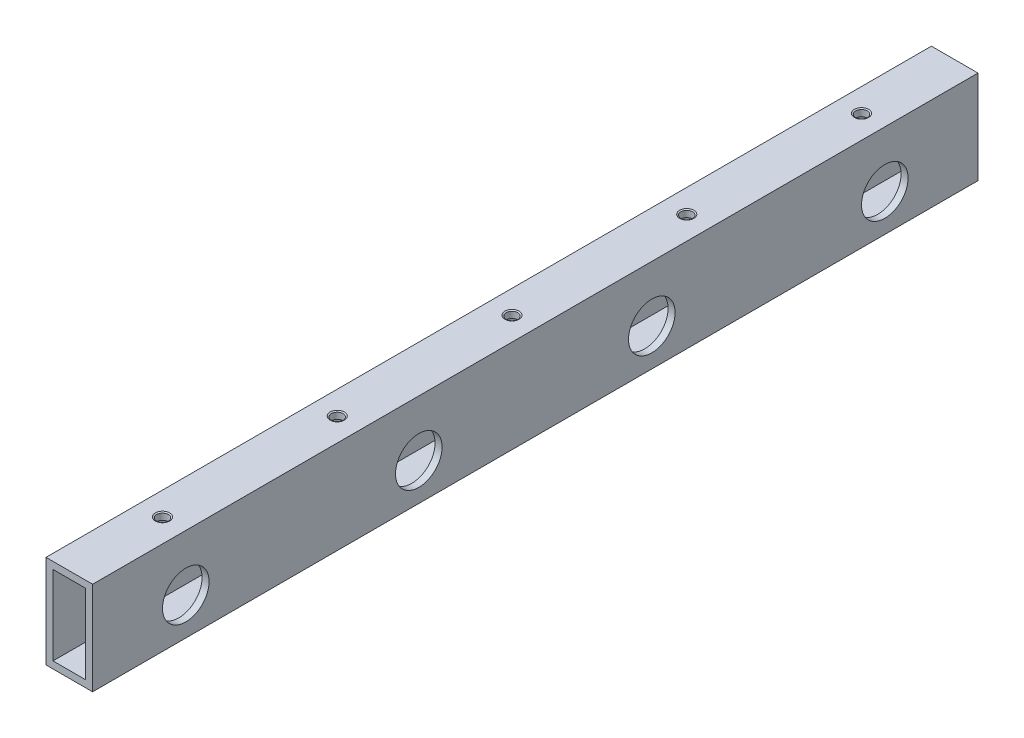
ISO-10303-21;
HEADER;
FILE_DESCRIPTION(('STEP AP214'),'2;1');
FILE_NAME('part.step','',(''),(''),'','','');
FILE_SCHEMA(('AUTOMOTIVE_DESIGN { 1 0 10303 214 1 1 1 1 }'));
ENDSEC;
DATA;
#1=APPLICATION_CONTEXT('core data for automotive mechanical design processes');
#2=APPLICATION_PROTOCOL_DEFINITION('international standard','automotive_design',2000,#1);
#3=PRODUCT_CONTEXT('',#1,'mechanical');
#4=PRODUCT('Part','Part','',(#3));
#5=PRODUCT_RELATED_PRODUCT_CATEGORY('part','',(#4));
#6=PRODUCT_DEFINITION_FORMATION('','',#4);
#7=PRODUCT_DEFINITION_CONTEXT('part definition',#1,'design');
#8=PRODUCT_DEFINITION('design','',#6,#7);
#9=PRODUCT_DEFINITION_SHAPE('','',#8);
#10=(LENGTH_UNIT() NAMED_UNIT(*) SI_UNIT(.MILLI.,.METRE.));
#11=(NAMED_UNIT(*) PLANE_ANGLE_UNIT() SI_UNIT($,.RADIAN.));
#12=(NAMED_UNIT(*) SI_UNIT($,.STERADIAN.) SOLID_ANGLE_UNIT());
#13=UNCERTAINTY_MEASURE_WITH_UNIT(LENGTH_MEASURE(1.E-05),#10,'distance_accuracy_value','');
#14=(GEOMETRIC_REPRESENTATION_CONTEXT(3) GLOBAL_UNCERTAINTY_ASSIGNED_CONTEXT((#13)) GLOBAL_UNIT_ASSIGNED_CONTEXT((#10,
#11,#12)) REPRESENTATION_CONTEXT('',''));
#15=CARTESIAN_POINT('',(0.,0.,0.));
#16=DIRECTION('',(0.,0.,1.));
#17=DIRECTION('',(1.,0.,0.));
#18=AXIS2_PLACEMENT_3D('',#15,#16,#17);
#19=CARTESIAN_POINT('',(0.,0.,190.));
#20=DIRECTION('',(0.,0.,1.));
#21=DIRECTION('',(1.,0.,0.));
#22=AXIS2_PLACEMENT_3D('',#19,#20,#21);
#23=PLANE('',#22);
#24=DIRECTION('',(0.,-1.,0.));
#25=VECTOR('',#24,1.);
#26=CARTESIAN_POINT('',(0.,0.,190.));
#27=LINE('',#26,#25);
#28=CARTESIAN_POINT('',(0.,20.,190.));
#29=VERTEX_POINT('',#28);
#30=CARTESIAN_POINT('',(0.,0.,190.));
#31=VERTEX_POINT('',#30);
#32=EDGE_CURVE('E169',#29,#31,#27,.T.);
#33=ORIENTED_EDGE('',*,*,#32,.T.);
#34=DIRECTION('',(1.,0.,0.));
#35=VECTOR('',#34,1.);
#36=CARTESIAN_POINT('',(0.,0.,190.));
#37=LINE('',#36,#35);
#38=CARTESIAN_POINT('',(10.,0.,190.));
#39=VERTEX_POINT('',#38);
#40=EDGE_CURVE('E172',#31,#39,#37,.T.);
#41=ORIENTED_EDGE('',*,*,#40,.T.);
#42=DIRECTION('',(0.,1.,0.));
#43=VECTOR('',#42,1.);
#44=CARTESIAN_POINT('',(10.,0.,190.));
#45=LINE('',#44,#43);
#46=CARTESIAN_POINT('',(10.,20.,190.));
#47=VERTEX_POINT('',#46);
#48=EDGE_CURVE('E175',#39,#47,#45,.T.);
#49=ORIENTED_EDGE('',*,*,#48,.T.);
#50=DIRECTION('',(-1.,0.,0.));
#51=VECTOR('',#50,1.);
#52=CARTESIAN_POINT('',(0.,20.,190.));
#53=LINE('',#52,#51);
#54=EDGE_CURVE('E177',#47,#29,#53,.T.);
#55=ORIENTED_EDGE('',*,*,#54,.T.);
#56=EDGE_LOOP('',(#33,#41,#49,#55));
#57=FACE_BOUND('',#56,.T.);
#58=DIRECTION('',(1.,0.,0.));
#59=VECTOR('',#58,1.);
#60=CARTESIAN_POINT('',(0.,1.5,190.));
#61=LINE('',#60,#59);
#62=CARTESIAN_POINT('',(1.5,1.5,190.));
#63=VERTEX_POINT('',#62);
#64=CARTESIAN_POINT('',(8.5,1.5,190.));
#65=VERTEX_POINT('',#64);
#66=EDGE_CURVE('E139',#63,#65,#61,.T.);
#67=ORIENTED_EDGE('',*,*,#66,.F.);
#68=DIRECTION('',(0.,-1.,0.));
#69=VECTOR('',#68,1.);
#70=CARTESIAN_POINT('',(1.5,20.,190.));
#71=LINE('',#70,#69);
#72=CARTESIAN_POINT('',(1.5,18.5,190.));
#73=VERTEX_POINT('',#72);
#74=EDGE_CURVE('E131',#73,#63,#71,.T.);
#75=ORIENTED_EDGE('',*,*,#74,.F.);
#76=DIRECTION('',(-1.,0.,0.));
#77=VECTOR('',#76,1.);
#78=CARTESIAN_POINT('',(0.,18.5,190.));
#79=LINE('',#78,#77);
#80=CARTESIAN_POINT('',(8.5,18.5,190.));
#81=VERTEX_POINT('',#80);
#82=EDGE_CURVE('E153',#81,#73,#79,.T.);
#83=ORIENTED_EDGE('',*,*,#82,.F.);
#84=DIRECTION('',(0.,1.,0.));
#85=VECTOR('',#84,1.);
#86=CARTESIAN_POINT('',(8.5,20.,190.));
#87=LINE('',#86,#85);
#88=EDGE_CURVE('E151',#65,#81,#87,.T.);
#89=ORIENTED_EDGE('',*,*,#88,.F.);
#90=EDGE_LOOP('',(#67,#75,#83,#89));
#91=FACE_BOUND('',#90,.T.);
#92=ADVANCED_FACE('F64',(#57,#91),#23,.T.);
#93=CARTESIAN_POINT('',(0.,0.,0.));
#94=DIRECTION('',(0.,0.,1.));
#95=DIRECTION('',(1.,0.,0.));
#96=AXIS2_PLACEMENT_3D('',#93,#94,#95);
#97=PLANE('',#96);
#98=DIRECTION('',(0.,-1.,0.));
#99=VECTOR('',#98,1.);
#100=CARTESIAN_POINT('',(0.,0.,0.));
#101=LINE('',#100,#99);
#102=CARTESIAN_POINT('',(0.,20.,0.));
#103=VERTEX_POINT('',#102);
#104=CARTESIAN_POINT('',(0.,0.,0.));
#105=VERTEX_POINT('',#104);
#106=EDGE_CURVE('E147',#103,#105,#101,.T.);
#107=ORIENTED_EDGE('',*,*,#106,.F.);
#108=DIRECTION('',(-1.,0.,0.));
#109=VECTOR('',#108,1.);
#110=CARTESIAN_POINT('',(0.,20.,0.));
#111=LINE('',#110,#109);
#112=CARTESIAN_POINT('',(10.,20.,0.));
#113=VERTEX_POINT('',#112);
#114=EDGE_CURVE('E173',#113,#103,#111,.T.);
#115=ORIENTED_EDGE('',*,*,#114,.F.);
#116=DIRECTION('',(0.,1.,0.));
#117=VECTOR('',#116,1.);
#118=CARTESIAN_POINT('',(10.,0.,0.));
#119=LINE('',#118,#117);
#120=CARTESIAN_POINT('',(10.,0.,0.));
#121=VERTEX_POINT('',#120);
#122=EDGE_CURVE('E184',#121,#113,#119,.T.);
#123=ORIENTED_EDGE('',*,*,#122,.F.);
#124=DIRECTION('',(1.,0.,0.));
#125=VECTOR('',#124,1.);
#126=CARTESIAN_POINT('',(0.,0.,0.));
#127=LINE('',#126,#125);
#128=EDGE_CURVE('E182',#105,#121,#127,.T.);
#129=ORIENTED_EDGE('',*,*,#128,.F.);
#130=EDGE_LOOP('',(#107,#115,#123,#129));
#131=FACE_BOUND('',#130,.T.);
#132=DIRECTION('',(0.,-1.,0.));
#133=VECTOR('',#132,1.);
#134=CARTESIAN_POINT('',(1.5,20.,0.));
#135=LINE('',#134,#133);
#136=CARTESIAN_POINT('',(1.5,18.5,0.));
#137=VERTEX_POINT('',#136);
#138=CARTESIAN_POINT('',(1.5,1.5,0.));
#139=VERTEX_POINT('',#138);
#140=EDGE_CURVE('E89',#137,#139,#135,.T.);
#141=ORIENTED_EDGE('',*,*,#140,.T.);
#142=DIRECTION('',(1.,0.,0.));
#143=VECTOR('',#142,1.);
#144=CARTESIAN_POINT('',(0.,1.5,0.));
#145=LINE('',#144,#143);
#146=CARTESIAN_POINT('',(8.5,1.5,0.));
#147=VERTEX_POINT('',#146);
#148=EDGE_CURVE('E146',#139,#147,#145,.T.);
#149=ORIENTED_EDGE('',*,*,#148,.T.);
#150=DIRECTION('',(0.,1.,0.));
#151=VECTOR('',#150,1.);
#152=CARTESIAN_POINT('',(8.5,20.,0.));
#153=LINE('',#152,#151);
#154=CARTESIAN_POINT('',(8.5,18.5,0.));
#155=VERTEX_POINT('',#154);
#156=EDGE_CURVE('E161',#147,#155,#153,.T.);
#157=ORIENTED_EDGE('',*,*,#156,.T.);
#158=DIRECTION('',(-1.,0.,0.));
#159=VECTOR('',#158,1.);
#160=CARTESIAN_POINT('',(0.,18.5,0.));
#161=LINE('',#160,#159);
#162=EDGE_CURVE('E140',#155,#137,#161,.T.);
#163=ORIENTED_EDGE('',*,*,#162,.T.);
#164=EDGE_LOOP('',(#141,#149,#157,#163));
#165=FACE_BOUND('',#164,.T.);
#166=ADVANCED_FACE('F283',(#131,#165),#97,.F.);
#167=CARTESIAN_POINT('',(0.,0.,190.));
#168=DIRECTION('',(1.,0.,0.));
#169=DIRECTION('',(0.,0.,-1.));
#170=AXIS2_PLACEMENT_3D('',#167,#168,#169);
#171=PLANE('',#170);
#172=ORIENTED_EDGE('',*,*,#106,.T.);
#173=DIRECTION('',(0.,0.,-1.));
#174=VECTOR('',#173,1.);
#175=CARTESIAN_POINT('',(0.,0.,190.));
#176=LINE('',#175,#174);
#177=EDGE_CURVE('E12',#31,#105,#176,.T.);
#178=ORIENTED_EDGE('',*,*,#177,.F.);
#179=ORIENTED_EDGE('',*,*,#32,.F.);
#180=DIRECTION('',(0.,0.,-1.));
#181=VECTOR('',#180,1.);
#182=CARTESIAN_POINT('',(0.,20.,190.));
#183=LINE('',#182,#181);
#184=EDGE_CURVE('E179',#29,#103,#183,.T.);
#185=ORIENTED_EDGE('',*,*,#184,.T.);
#186=EDGE_LOOP('',(#172,#178,#179,#185));
#187=FACE_BOUND('',#186,.T.);
#188=ADVANCED_FACE('F66',(#187),#171,.F.);
#189=CARTESIAN_POINT('',(0.,0.,190.));
#190=DIRECTION('',(0.,1.,0.));
#191=DIRECTION('',(0.,0.,1.));
#192=AXIS2_PLACEMENT_3D('',#189,#190,#191);
#193=PLANE('',#192);
#194=ORIENTED_EDGE('',*,*,#128,.T.);
#195=DIRECTION('',(0.,0.,-1.));
#196=VECTOR('',#195,1.);
#197=CARTESIAN_POINT('',(10.,0.,190.));
#198=LINE('',#197,#196);
#199=EDGE_CURVE('E73',#39,#121,#198,.T.);
#200=ORIENTED_EDGE('',*,*,#199,.F.);
#201=ORIENTED_EDGE('',*,*,#40,.F.);
#202=ORIENTED_EDGE('',*,*,#177,.T.);
#203=EDGE_LOOP('',(#194,#200,#201,#202));
#204=FACE_BOUND('',#203,.T.);
#205=ADVANCED_FACE('F287',(#204),#193,.F.);
#206=CARTESIAN_POINT('',(10.,0.,190.));
#207=DIRECTION('',(-1.,0.,0.));
#208=DIRECTION('',(0.,0.,1.));
#209=AXIS2_PLACEMENT_3D('',#206,#207,#208);
#210=PLANE('',#209);
#211=CARTESIAN_POINT('',(10.,8.,170.));
#212=DIRECTION('',(1.,0.,0.));
#213=DIRECTION('',(0.,0.,-1.));
#214=AXIS2_PLACEMENT_3D('',#211,#212,#213);
#215=CIRCLE('',#214,5.00000000000001);
#216=CARTESIAN_POINT('',(10.,8.,165.));
#217=VERTEX_POINT('',#216);
#218=EDGE_CURVE('E372',#217,#217,#215,.T.);
#219=ORIENTED_EDGE('',*,*,#218,.F.);
#220=EDGE_LOOP('',(#219));
#221=FACE_BOUND('',#220,.T.);
#222=CARTESIAN_POINT('',(10.,8.,120.));
#223=DIRECTION('',(1.,0.,0.));
#224=DIRECTION('',(0.,0.,-1.));
#225=AXIS2_PLACEMENT_3D('',#222,#223,#224);
#226=CIRCLE('',#225,5.00000000000001);
#227=CARTESIAN_POINT('',(10.,8.,115.));
#228=VERTEX_POINT('',#227);
#229=EDGE_CURVE('E234',#228,#228,#226,.T.);
#230=ORIENTED_EDGE('',*,*,#229,.F.);
#231=EDGE_LOOP('',(#230));
#232=FACE_BOUND('',#231,.T.);
#233=CARTESIAN_POINT('',(10.,8.,70.));
#234=DIRECTION('',(1.,0.,0.));
#235=DIRECTION('',(0.,0.,-1.));
#236=AXIS2_PLACEMENT_3D('',#233,#234,#235);
#237=CIRCLE('',#236,5.00000000000001);
#238=CARTESIAN_POINT('',(10.,8.,65.));
#239=VERTEX_POINT('',#238);
#240=EDGE_CURVE('E223',#239,#239,#237,.T.);
#241=ORIENTED_EDGE('',*,*,#240,.F.);
#242=EDGE_LOOP('',(#241));
#243=FACE_BOUND('',#242,.T.);
#244=CARTESIAN_POINT('',(10.,8.,20.));
#245=DIRECTION('',(1.,0.,0.));
#246=DIRECTION('',(0.,0.,-1.));
#247=AXIS2_PLACEMENT_3D('',#244,#245,#246);
#248=CIRCLE('',#247,5.00000000000001);
#249=CARTESIAN_POINT('',(10.,8.,15.));
#250=VERTEX_POINT('',#249);
#251=EDGE_CURVE('E220',#250,#250,#248,.T.);
#252=ORIENTED_EDGE('',*,*,#251,.F.);
#253=EDGE_LOOP('',(#252));
#254=FACE_BOUND('',#253,.T.);
#255=ORIENTED_EDGE('',*,*,#122,.T.);
#256=DIRECTION('',(0.,0.,-1.));
#257=VECTOR('',#256,1.);
#258=CARTESIAN_POINT('',(10.,20.,190.));
#259=LINE('',#258,#257);
#260=EDGE_CURVE('E189',#47,#113,#259,.T.);
#261=ORIENTED_EDGE('',*,*,#260,.F.);
#262=ORIENTED_EDGE('',*,*,#48,.F.);
#263=ORIENTED_EDGE('',*,*,#199,.T.);
#264=EDGE_LOOP('',(#255,#261,#262,#263));
#265=FACE_BOUND('',#264,.T.);
#266=ADVANCED_FACE('F270',(#221,#232,#243,#254,#265),#210,.F.);
#267=CARTESIAN_POINT('',(0.,20.,190.));
#268=DIRECTION('',(0.,-1.,0.));
#269=DIRECTION('',(0.,0.,-1.));
#270=AXIS2_PLACEMENT_3D('',#267,#268,#269);
#271=PLANE('',#270);
#272=CARTESIAN_POINT('',(5.,20.,20.));
#273=DIRECTION('',(0.,1.,0.));
#274=DIRECTION('',(0.,0.,1.));
#275=AXIS2_PLACEMENT_3D('',#272,#273,#274);
#276=CIRCLE('',#275,1.525);
#277=CARTESIAN_POINT('',(5.,20.,21.525));
#278=VERTEX_POINT('',#277);
#279=EDGE_CURVE('E219',#278,#278,#276,.T.);
#280=ORIENTED_EDGE('',*,*,#279,.F.);
#281=EDGE_LOOP('',(#280));
#282=FACE_BOUND('',#281,.T.);
#283=CARTESIAN_POINT('',(4.99999999999993,20.,57.5));
#284=DIRECTION('',(0.,1.,0.));
#285=DIRECTION('',(0.,0.,1.));
#286=AXIS2_PLACEMENT_3D('',#283,#284,#285);
#287=CIRCLE('',#286,1.525);
#288=CARTESIAN_POINT('',(4.99999999999993,20.,59.025));
#289=VERTEX_POINT('',#288);
#290=EDGE_CURVE('E215',#289,#289,#287,.T.);
#291=ORIENTED_EDGE('',*,*,#290,.F.);
#292=EDGE_LOOP('',(#291));
#293=FACE_BOUND('',#292,.T.);
#294=CARTESIAN_POINT('',(5.00000000000026,20.,95.));
#295=DIRECTION('',(0.,1.,0.));
#296=DIRECTION('',(0.,0.,1.));
#297=AXIS2_PLACEMENT_3D('',#294,#295,#296);
#298=CIRCLE('',#297,1.525);
#299=CARTESIAN_POINT('',(5.00000000000026,20.,96.525));
#300=VERTEX_POINT('',#299);
#301=EDGE_CURVE('E210',#300,#300,#298,.T.);
#302=ORIENTED_EDGE('',*,*,#301,.F.);
#303=EDGE_LOOP('',(#302));
#304=FACE_BOUND('',#303,.T.);
#305=CARTESIAN_POINT('',(5.00000000000039,20.,132.5));
#306=DIRECTION('',(0.,1.,0.));
#307=DIRECTION('',(0.,0.,1.));
#308=AXIS2_PLACEMENT_3D('',#305,#306,#307);
#309=CIRCLE('',#308,1.525);
#310=CARTESIAN_POINT('',(5.00000000000039,20.,134.025));
#311=VERTEX_POINT('',#310);
#312=EDGE_CURVE('E205',#311,#311,#309,.T.);
#313=ORIENTED_EDGE('',*,*,#312,.F.);
#314=EDGE_LOOP('',(#313));
#315=FACE_BOUND('',#314,.T.);
#316=CARTESIAN_POINT('',(5.00000000000052,20.,170.));
#317=DIRECTION('',(0.,1.,0.));
#318=DIRECTION('',(0.,0.,1.));
#319=AXIS2_PLACEMENT_3D('',#316,#317,#318);
#320=CIRCLE('',#319,1.525);
#321=CARTESIAN_POINT('',(5.00000000000052,20.,171.525));
#322=VERTEX_POINT('',#321);
#323=EDGE_CURVE('E200',#322,#322,#320,.T.);
#324=ORIENTED_EDGE('',*,*,#323,.F.);
#325=EDGE_LOOP('',(#324));
#326=FACE_BOUND('',#325,.T.);
#327=ORIENTED_EDGE('',*,*,#114,.T.);
#328=ORIENTED_EDGE('',*,*,#184,.F.);
#329=ORIENTED_EDGE('',*,*,#54,.F.);
#330=ORIENTED_EDGE('',*,*,#260,.T.);
#331=EDGE_LOOP('',(#327,#328,#329,#330));
#332=FACE_BOUND('',#331,.T.);
#333=ADVANCED_FACE('F267',(#282,#293,#304,#315,#326,#332),#271,.F.);
#334=CARTESIAN_POINT('',(1.5,20.,190.));
#335=DIRECTION('',(1.,0.,0.));
#336=DIRECTION('',(0.,0.,-1.));
#337=AXIS2_PLACEMENT_3D('',#334,#335,#336);
#338=PLANE('',#337);
#339=ORIENTED_EDGE('',*,*,#140,.F.);
#340=DIRECTION('',(0.,0.,-1.));
#341=VECTOR('',#340,1.);
#342=CARTESIAN_POINT('',(1.5,18.5,190.));
#343=LINE('',#342,#341);
#344=EDGE_CURVE('E135',#73,#137,#343,.T.);
#345=ORIENTED_EDGE('',*,*,#344,.F.);
#346=ORIENTED_EDGE('',*,*,#74,.T.);
#347=DIRECTION('',(0.,0.,-1.));
#348=VECTOR('',#347,1.);
#349=CARTESIAN_POINT('',(1.5,1.5,190.));
#350=LINE('',#349,#348);
#351=EDGE_CURVE('E134',#63,#139,#350,.T.);
#352=ORIENTED_EDGE('',*,*,#351,.T.);
#353=EDGE_LOOP('',(#339,#345,#346,#352));
#354=FACE_BOUND('',#353,.T.);
#355=ADVANCED_FACE('F133',(#354),#338,.T.);
#356=CARTESIAN_POINT('',(0.,1.5,190.));
#357=DIRECTION('',(0.,1.,0.));
#358=DIRECTION('',(0.,0.,1.));
#359=AXIS2_PLACEMENT_3D('',#356,#357,#358);
#360=PLANE('',#359);
#361=ORIENTED_EDGE('',*,*,#148,.F.);
#362=ORIENTED_EDGE('',*,*,#351,.F.);
#363=ORIENTED_EDGE('',*,*,#66,.T.);
#364=DIRECTION('',(0.,0.,-1.));
#365=VECTOR('',#364,1.);
#366=CARTESIAN_POINT('',(8.5,1.5,190.));
#367=LINE('',#366,#365);
#368=EDGE_CURVE('E148',#65,#147,#367,.T.);
#369=ORIENTED_EDGE('',*,*,#368,.T.);
#370=EDGE_LOOP('',(#361,#362,#363,#369));
#371=FACE_BOUND('',#370,.T.);
#372=ADVANCED_FACE('F143',(#371),#360,.T.);
#373=CARTESIAN_POINT('',(8.5,20.,190.));
#374=DIRECTION('',(-1.,0.,0.));
#375=DIRECTION('',(0.,0.,1.));
#376=AXIS2_PLACEMENT_3D('',#373,#374,#375);
#377=PLANE('',#376);
#378=CARTESIAN_POINT('',(8.5,8.,170.));
#379=DIRECTION('',(-1.,0.,0.));
#380=DIRECTION('',(0.,0.,1.));
#381=AXIS2_PLACEMENT_3D('',#378,#379,#380);
#382=CIRCLE('',#381,5.00000000000001);
#383=CARTESIAN_POINT('',(8.5,8.,175.));
#384=VERTEX_POINT('',#383);
#385=EDGE_CURVE('E68',#384,#384,#382,.T.);
#386=ORIENTED_EDGE('',*,*,#385,.F.);
#387=EDGE_LOOP('',(#386));
#388=FACE_BOUND('',#387,.T.);
#389=CARTESIAN_POINT('',(8.5,8.,120.));
#390=DIRECTION('',(-1.,0.,0.));
#391=DIRECTION('',(0.,0.,1.));
#392=AXIS2_PLACEMENT_3D('',#389,#390,#391);
#393=CIRCLE('',#392,5.00000000000001);
#394=CARTESIAN_POINT('',(8.5,8.,125.));
#395=VERTEX_POINT('',#394);
#396=EDGE_CURVE('E229',#395,#395,#393,.T.);
#397=ORIENTED_EDGE('',*,*,#396,.F.);
#398=EDGE_LOOP('',(#397));
#399=FACE_BOUND('',#398,.T.);
#400=CARTESIAN_POINT('',(8.5,8.,70.));
#401=DIRECTION('',(-1.,0.,0.));
#402=DIRECTION('',(0.,0.,1.));
#403=AXIS2_PLACEMENT_3D('',#400,#401,#402);
#404=CIRCLE('',#403,5.00000000000001);
#405=CARTESIAN_POINT('',(8.5,8.,75.));
#406=VERTEX_POINT('',#405);
#407=EDGE_CURVE('E221',#406,#406,#404,.T.);
#408=ORIENTED_EDGE('',*,*,#407,.F.);
#409=EDGE_LOOP('',(#408));
#410=FACE_BOUND('',#409,.T.);
#411=CARTESIAN_POINT('',(8.5,8.,20.));
#412=DIRECTION('',(-1.,0.,0.));
#413=DIRECTION('',(0.,0.,1.));
#414=AXIS2_PLACEMENT_3D('',#411,#412,#413);
#415=CIRCLE('',#414,5.00000000000001);
#416=CARTESIAN_POINT('',(8.5,8.,25.));
#417=VERTEX_POINT('',#416);
#418=EDGE_CURVE('E217',#417,#417,#415,.T.);
#419=ORIENTED_EDGE('',*,*,#418,.F.);
#420=EDGE_LOOP('',(#419));
#421=FACE_BOUND('',#420,.T.);
#422=ORIENTED_EDGE('',*,*,#156,.F.);
#423=ORIENTED_EDGE('',*,*,#368,.F.);
#424=ORIENTED_EDGE('',*,*,#88,.T.);
#425=DIRECTION('',(0.,0.,-1.));
#426=VECTOR('',#425,1.);
#427=CARTESIAN_POINT('',(8.5,18.5,190.));
#428=LINE('',#427,#426);
#429=EDGE_CURVE('E81',#81,#155,#428,.T.);
#430=ORIENTED_EDGE('',*,*,#429,.T.);
#431=EDGE_LOOP('',(#422,#423,#424,#430));
#432=FACE_BOUND('',#431,.T.);
#433=ADVANCED_FACE('F310',(#388,#399,#410,#421,#432),#377,.T.);
#434=CARTESIAN_POINT('',(0.,18.5,190.));
#435=DIRECTION('',(0.,-1.,0.));
#436=DIRECTION('',(0.,0.,-1.));
#437=AXIS2_PLACEMENT_3D('',#434,#435,#436);
#438=PLANE('',#437);
#439=CARTESIAN_POINT('',(5.,18.5,20.));
#440=DIRECTION('',(0.,-1.,0.));
#441=DIRECTION('',(0.,0.,-1.));
#442=AXIS2_PLACEMENT_3D('',#439,#440,#441);
#443=CIRCLE('',#442,1.25);
#444=CARTESIAN_POINT('',(5.,18.5,18.75));
#445=VERTEX_POINT('',#444);
#446=EDGE_CURVE('E212',#445,#445,#443,.T.);
#447=ORIENTED_EDGE('',*,*,#446,.F.);
#448=EDGE_LOOP('',(#447));
#449=FACE_BOUND('',#448,.T.);
#450=CARTESIAN_POINT('',(4.99999999999993,18.5,57.5));
#451=DIRECTION('',(0.,-1.,0.));
#452=DIRECTION('',(0.,0.,-1.));
#453=AXIS2_PLACEMENT_3D('',#450,#451,#452);
#454=CIRCLE('',#453,1.25);
#455=CARTESIAN_POINT('',(4.99999999999993,18.5,56.25));
#456=VERTEX_POINT('',#455);
#457=EDGE_CURVE('E207',#456,#456,#454,.T.);
#458=ORIENTED_EDGE('',*,*,#457,.F.);
#459=EDGE_LOOP('',(#458));
#460=FACE_BOUND('',#459,.T.);
#461=CARTESIAN_POINT('',(5.00000000000026,18.5,95.));
#462=DIRECTION('',(0.,-1.,0.));
#463=DIRECTION('',(0.,0.,-1.));
#464=AXIS2_PLACEMENT_3D('',#461,#462,#463);
#465=CIRCLE('',#464,1.25);
#466=CARTESIAN_POINT('',(5.00000000000026,18.5,93.75));
#467=VERTEX_POINT('',#466);
#468=EDGE_CURVE('E202',#467,#467,#465,.T.);
#469=ORIENTED_EDGE('',*,*,#468,.F.);
#470=EDGE_LOOP('',(#469));
#471=FACE_BOUND('',#470,.T.);
#472=CARTESIAN_POINT('',(5.00000000000039,18.5,132.5));
#473=DIRECTION('',(0.,-1.,0.));
#474=DIRECTION('',(0.,0.,-1.));
#475=AXIS2_PLACEMENT_3D('',#472,#473,#474);
#476=CIRCLE('',#475,1.25);
#477=CARTESIAN_POINT('',(5.00000000000039,18.5,131.25));
#478=VERTEX_POINT('',#477);
#479=EDGE_CURVE('E197',#478,#478,#476,.T.);
#480=ORIENTED_EDGE('',*,*,#479,.F.);
#481=EDGE_LOOP('',(#480));
#482=FACE_BOUND('',#481,.T.);
#483=CARTESIAN_POINT('',(5.00000000000052,18.5,170.));
#484=DIRECTION('',(0.,-1.,0.));
#485=DIRECTION('',(0.,0.,-1.));
#486=AXIS2_PLACEMENT_3D('',#483,#484,#485);
#487=CIRCLE('',#486,1.25);
#488=CARTESIAN_POINT('',(5.00000000000052,18.5,168.75));
#489=VERTEX_POINT('',#488);
#490=EDGE_CURVE('E159',#489,#489,#487,.T.);
#491=ORIENTED_EDGE('',*,*,#490,.F.);
#492=EDGE_LOOP('',(#491));
#493=FACE_BOUND('',#492,.T.);
#494=ORIENTED_EDGE('',*,*,#162,.F.);
#495=ORIENTED_EDGE('',*,*,#429,.F.);
#496=ORIENTED_EDGE('',*,*,#82,.T.);
#497=ORIENTED_EDGE('',*,*,#344,.T.);
#498=EDGE_LOOP('',(#494,#495,#496,#497));
#499=FACE_BOUND('',#498,.T.);
#500=ADVANCED_FACE('F313',(#449,#460,#471,#482,#493,#499),#438,.T.);
#501=CARTESIAN_POINT('',(5.00000000000052,20.,170.));
#502=DIRECTION('',(0.,1.,0.));
#503=DIRECTION('',(0.,0.,1.));
#504=AXIS2_PLACEMENT_3D('',#501,#502,#503);
#505=CYLINDRICAL_SURFACE('',#504,1.25);
#506=ORIENTED_EDGE('',*,*,#490,.T.);
#507=EDGE_LOOP('',(#506));
#508=FACE_BOUND('',#507,.T.);
#509=CARTESIAN_POINT('',(5.00000000000052,19.8412286759729,170.));
#510=DIRECTION('',(0.,1.,0.));
#511=DIRECTION('',(0.,0.,1.));
#512=AXIS2_PLACEMENT_3D('',#509,#510,#511);
#513=CIRCLE('',#512,1.25);
#514=CARTESIAN_POINT('',(5.00000000000052,19.8412286759729,171.25));
#515=VERTEX_POINT('',#514);
#516=EDGE_CURVE('E196',#515,#515,#513,.T.);
#517=ORIENTED_EDGE('',*,*,#516,.T.);
#518=EDGE_LOOP('',(#517));
#519=FACE_BOUND('',#518,.T.);
#520=ADVANCED_FACE('F258',(#508,#519),#505,.F.);
#521=CARTESIAN_POINT('',(5.00000000000052,20.,170.));
#522=DIRECTION('',(0.,1.,0.));
#523=DIRECTION('',(0.,0.,1.));
#524=AXIS2_PLACEMENT_3D('',#521,#522,#523);
#525=CONICAL_SURFACE('',#524,1.525,1.0471975511966);
#526=ORIENTED_EDGE('',*,*,#516,.F.);
#527=EDGE_LOOP('',(#526));
#528=FACE_BOUND('',#527,.T.);
#529=ORIENTED_EDGE('',*,*,#323,.T.);
#530=EDGE_LOOP('',(#529));
#531=FACE_BOUND('',#530,.T.);
#532=ADVANCED_FACE('F260',(#528,#531),#525,.F.);
#533=CARTESIAN_POINT('',(5.00000000000039,20.,132.5));
#534=DIRECTION('',(0.,1.,0.));
#535=DIRECTION('',(0.,0.,1.));
#536=AXIS2_PLACEMENT_3D('',#533,#534,#535);
#537=CYLINDRICAL_SURFACE('',#536,1.25);
#538=ORIENTED_EDGE('',*,*,#479,.T.);
#539=EDGE_LOOP('',(#538));
#540=FACE_BOUND('',#539,.T.);
#541=CARTESIAN_POINT('',(5.00000000000039,19.8412286759729,132.5));
#542=DIRECTION('',(0.,1.,0.));
#543=DIRECTION('',(0.,0.,1.));
#544=AXIS2_PLACEMENT_3D('',#541,#542,#543);
#545=CIRCLE('',#544,1.25);
#546=CARTESIAN_POINT('',(5.00000000000039,19.8412286759729,133.75));
#547=VERTEX_POINT('',#546);
#548=EDGE_CURVE('E201',#547,#547,#545,.T.);
#549=ORIENTED_EDGE('',*,*,#548,.T.);
#550=EDGE_LOOP('',(#549));
#551=FACE_BOUND('',#550,.T.);
#552=ADVANCED_FACE('F263',(#540,#551),#537,.F.);
#553=CARTESIAN_POINT('',(5.00000000000039,20.,132.5));
#554=DIRECTION('',(0.,1.,0.));
#555=DIRECTION('',(0.,0.,1.));
#556=AXIS2_PLACEMENT_3D('',#553,#554,#555);
#557=CONICAL_SURFACE('',#556,1.525,1.0471975511966);
#558=ORIENTED_EDGE('',*,*,#548,.F.);
#559=EDGE_LOOP('',(#558));
#560=FACE_BOUND('',#559,.T.);
#561=ORIENTED_EDGE('',*,*,#312,.T.);
#562=EDGE_LOOP('',(#561));
#563=FACE_BOUND('',#562,.T.);
#564=ADVANCED_FACE('F323',(#560,#563),#557,.F.);
#565=CARTESIAN_POINT('',(5.00000000000026,20.,95.));
#566=DIRECTION('',(0.,1.,0.));
#567=DIRECTION('',(0.,0.,1.));
#568=AXIS2_PLACEMENT_3D('',#565,#566,#567);
#569=CYLINDRICAL_SURFACE('',#568,1.25);
#570=ORIENTED_EDGE('',*,*,#468,.T.);
#571=EDGE_LOOP('',(#570));
#572=FACE_BOUND('',#571,.T.);
#573=CARTESIAN_POINT('',(5.00000000000026,19.8412286759729,95.));
#574=DIRECTION('',(0.,1.,0.));
#575=DIRECTION('',(0.,0.,1.));
#576=AXIS2_PLACEMENT_3D('',#573,#574,#575);
#577=CIRCLE('',#576,1.25);
#578=CARTESIAN_POINT('',(5.00000000000026,19.8412286759729,96.25));
#579=VERTEX_POINT('',#578);
#580=EDGE_CURVE('E206',#579,#579,#577,.T.);
#581=ORIENTED_EDGE('',*,*,#580,.T.);
#582=EDGE_LOOP('',(#581));
#583=FACE_BOUND('',#582,.T.);
#584=ADVANCED_FACE('F327',(#572,#583),#569,.F.);
#585=CARTESIAN_POINT('',(5.00000000000026,20.,95.));
#586=DIRECTION('',(0.,1.,0.));
#587=DIRECTION('',(0.,0.,1.));
#588=AXIS2_PLACEMENT_3D('',#585,#586,#587);
#589=CONICAL_SURFACE('',#588,1.525,1.0471975511966);
#590=ORIENTED_EDGE('',*,*,#580,.F.);
#591=EDGE_LOOP('',(#590));
#592=FACE_BOUND('',#591,.T.);
#593=ORIENTED_EDGE('',*,*,#301,.T.);
#594=EDGE_LOOP('',(#593));
#595=FACE_BOUND('',#594,.T.);
#596=ADVANCED_FACE('F331',(#592,#595),#589,.F.);
#597=CARTESIAN_POINT('',(4.99999999999993,20.,57.5));
#598=DIRECTION('',(0.,1.,0.));
#599=DIRECTION('',(0.,0.,1.));
#600=AXIS2_PLACEMENT_3D('',#597,#598,#599);
#601=CYLINDRICAL_SURFACE('',#600,1.25);
#602=ORIENTED_EDGE('',*,*,#457,.T.);
#603=EDGE_LOOP('',(#602));
#604=FACE_BOUND('',#603,.T.);
#605=CARTESIAN_POINT('',(4.99999999999993,19.8412286759729,57.5));
#606=DIRECTION('',(0.,1.,0.));
#607=DIRECTION('',(0.,0.,1.));
#608=AXIS2_PLACEMENT_3D('',#605,#606,#607);
#609=CIRCLE('',#608,1.25);
#610=CARTESIAN_POINT('',(4.99999999999993,19.8412286759729,58.75));
#611=VERTEX_POINT('',#610);
#612=EDGE_CURVE('E211',#611,#611,#609,.T.);
#613=ORIENTED_EDGE('',*,*,#612,.T.);
#614=EDGE_LOOP('',(#613));
#615=FACE_BOUND('',#614,.T.);
#616=ADVANCED_FACE('F335',(#604,#615),#601,.F.);
#617=CARTESIAN_POINT('',(4.99999999999993,20.,57.5));
#618=DIRECTION('',(0.,1.,0.));
#619=DIRECTION('',(0.,0.,1.));
#620=AXIS2_PLACEMENT_3D('',#617,#618,#619);
#621=CONICAL_SURFACE('',#620,1.525,1.0471975511966);
#622=ORIENTED_EDGE('',*,*,#612,.F.);
#623=EDGE_LOOP('',(#622));
#624=FACE_BOUND('',#623,.T.);
#625=ORIENTED_EDGE('',*,*,#290,.T.);
#626=EDGE_LOOP('',(#625));
#627=FACE_BOUND('',#626,.T.);
#628=ADVANCED_FACE('F339',(#624,#627),#621,.F.);
#629=CARTESIAN_POINT('',(5.,20.,20.));
#630=DIRECTION('',(0.,1.,0.));
#631=DIRECTION('',(0.,0.,1.));
#632=AXIS2_PLACEMENT_3D('',#629,#630,#631);
#633=CYLINDRICAL_SURFACE('',#632,1.25);
#634=ORIENTED_EDGE('',*,*,#446,.T.);
#635=EDGE_LOOP('',(#634));
#636=FACE_BOUND('',#635,.T.);
#637=CARTESIAN_POINT('',(5.,19.8412286759729,20.));
#638=DIRECTION('',(0.,1.,0.));
#639=DIRECTION('',(0.,0.,1.));
#640=AXIS2_PLACEMENT_3D('',#637,#638,#639);
#641=CIRCLE('',#640,1.25);
#642=CARTESIAN_POINT('',(5.,19.8412286759729,21.25));
#643=VERTEX_POINT('',#642);
#644=EDGE_CURVE('E216',#643,#643,#641,.T.);
#645=ORIENTED_EDGE('',*,*,#644,.T.);
#646=EDGE_LOOP('',(#645));
#647=FACE_BOUND('',#646,.T.);
#648=ADVANCED_FACE('F343',(#636,#647),#633,.F.);
#649=CARTESIAN_POINT('',(5.,20.,20.));
#650=DIRECTION('',(0.,1.,0.));
#651=DIRECTION('',(0.,0.,1.));
#652=AXIS2_PLACEMENT_3D('',#649,#650,#651);
#653=CONICAL_SURFACE('',#652,1.525,1.0471975511966);
#654=ORIENTED_EDGE('',*,*,#644,.F.);
#655=EDGE_LOOP('',(#654));
#656=FACE_BOUND('',#655,.T.);
#657=ORIENTED_EDGE('',*,*,#279,.T.);
#658=EDGE_LOOP('',(#657));
#659=FACE_BOUND('',#658,.T.);
#660=ADVANCED_FACE('F347',(#656,#659),#653,.F.);
#661=CARTESIAN_POINT('',(10.,8.,20.));
#662=DIRECTION('',(1.,0.,0.));
#663=DIRECTION('',(0.,0.,-1.));
#664=AXIS2_PLACEMENT_3D('',#661,#662,#663);
#665=CYLINDRICAL_SURFACE('',#664,5.00000000000001);
#666=ORIENTED_EDGE('',*,*,#418,.T.);
#667=EDGE_LOOP('',(#666));
#668=FACE_BOUND('',#667,.T.);
#669=ORIENTED_EDGE('',*,*,#251,.T.);
#670=EDGE_LOOP('',(#669));
#671=FACE_BOUND('',#670,.T.);
#672=ADVANCED_FACE('F351',(#668,#671),#665,.F.);
#673=CARTESIAN_POINT('',(10.,8.,70.));
#674=DIRECTION('',(1.,0.,0.));
#675=DIRECTION('',(0.,0.,-1.));
#676=AXIS2_PLACEMENT_3D('',#673,#674,#675);
#677=CYLINDRICAL_SURFACE('',#676,5.00000000000001);
#678=ORIENTED_EDGE('',*,*,#407,.T.);
#679=EDGE_LOOP('',(#678));
#680=FACE_BOUND('',#679,.T.);
#681=ORIENTED_EDGE('',*,*,#240,.T.);
#682=EDGE_LOOP('',(#681));
#683=FACE_BOUND('',#682,.T.);
#684=ADVANCED_FACE('F355',(#680,#683),#677,.F.);
#685=CARTESIAN_POINT('',(10.,8.,120.));
#686=DIRECTION('',(1.,0.,0.));
#687=DIRECTION('',(0.,0.,-1.));
#688=AXIS2_PLACEMENT_3D('',#685,#686,#687);
#689=CYLINDRICAL_SURFACE('',#688,5.00000000000001);
#690=ORIENTED_EDGE('',*,*,#396,.T.);
#691=EDGE_LOOP('',(#690));
#692=FACE_BOUND('',#691,.T.);
#693=ORIENTED_EDGE('',*,*,#229,.T.);
#694=EDGE_LOOP('',(#693));
#695=FACE_BOUND('',#694,.T.);
#696=ADVANCED_FACE('F359',(#692,#695),#689,.F.);
#697=CARTESIAN_POINT('',(10.,8.,170.));
#698=DIRECTION('',(1.,0.,0.));
#699=DIRECTION('',(0.,0.,-1.));
#700=AXIS2_PLACEMENT_3D('',#697,#698,#699);
#701=CYLINDRICAL_SURFACE('',#700,5.00000000000001);
#702=ORIENTED_EDGE('',*,*,#385,.T.);
#703=EDGE_LOOP('',(#702));
#704=FACE_BOUND('',#703,.T.);
#705=ORIENTED_EDGE('',*,*,#218,.T.);
#706=EDGE_LOOP('',(#705));
#707=FACE_BOUND('',#706,.T.);
#708=ADVANCED_FACE('F362',(#704,#707),#701,.F.);
#709=CLOSED_SHELL('',(#92,#166,#188,#205,#266,#333,#355,#372,#433,#500,#520,#532,#552,#564,#584,
#596,#616,#628,#648,#660,#672,#684,#696,#708));
#710=MANIFOLD_SOLID_BREP('B2',#709);
#711=ADVANCED_BREP_SHAPE_REPRESENTATION('',(#18,#710),#14);
#712=SHAPE_DEFINITION_REPRESENTATION(#9,#711);
ENDSEC;
END-ISO-10303-21;
